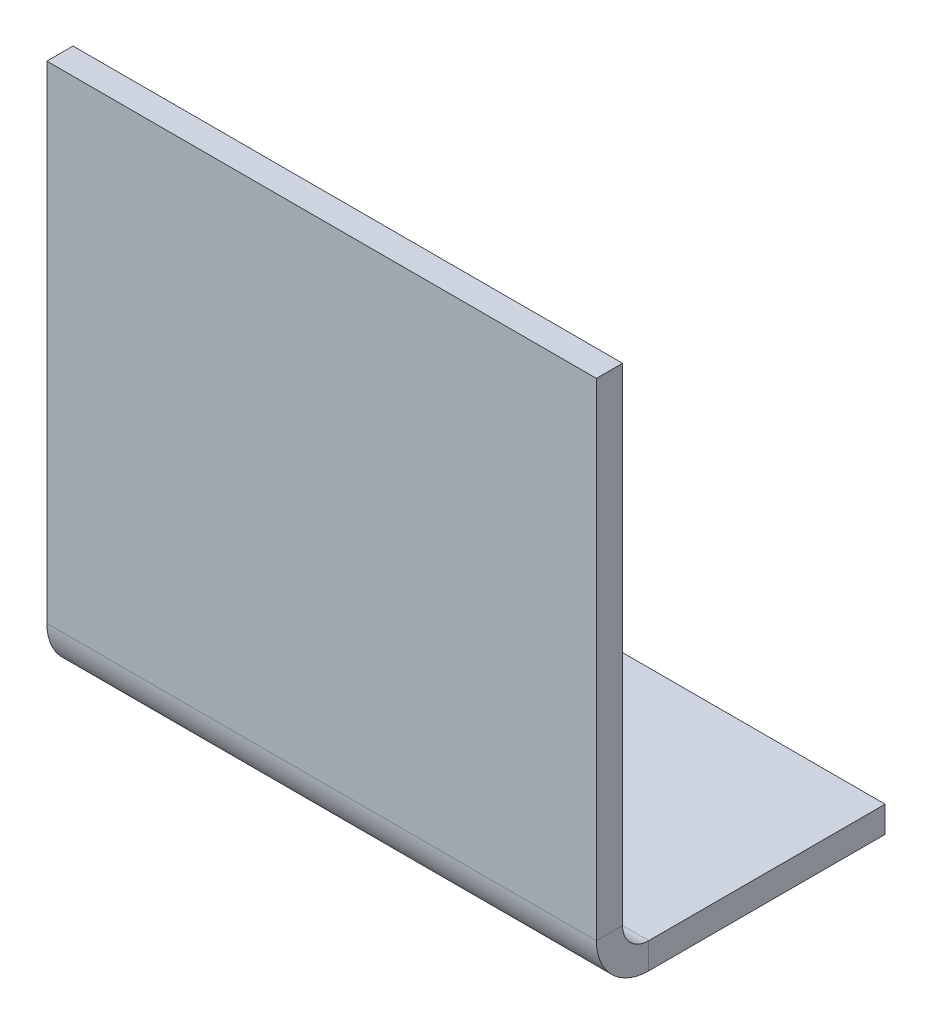
ISO-10303-21;
HEADER;
FILE_DESCRIPTION(('STEP AP214'),'2;1');
FILE_NAME('part.step','',(''),(''),'','','');
FILE_SCHEMA(('AUTOMOTIVE_DESIGN { 1 0 10303 214 1 1 1 1 }'));
ENDSEC;
DATA;
#1=APPLICATION_CONTEXT('core data for automotive mechanical design processes');
#2=APPLICATION_PROTOCOL_DEFINITION('international standard','automotive_design',2000,#1);
#3=PRODUCT_CONTEXT('',#1,'mechanical');
#4=PRODUCT('Part','Part','',(#3));
#5=PRODUCT_RELATED_PRODUCT_CATEGORY('part','',(#4));
#6=PRODUCT_DEFINITION_FORMATION('','',#4);
#7=PRODUCT_DEFINITION_CONTEXT('part definition',#1,'design');
#8=PRODUCT_DEFINITION('design','',#6,#7);
#9=PRODUCT_DEFINITION_SHAPE('','',#8);
#10=(LENGTH_UNIT() NAMED_UNIT(*) SI_UNIT(.MILLI.,.METRE.));
#11=(NAMED_UNIT(*) PLANE_ANGLE_UNIT() SI_UNIT($,.RADIAN.));
#12=(NAMED_UNIT(*) SI_UNIT($,.STERADIAN.) SOLID_ANGLE_UNIT());
#13=UNCERTAINTY_MEASURE_WITH_UNIT(LENGTH_MEASURE(1.E-05),#10,'distance_accuracy_value','');
#14=(GEOMETRIC_REPRESENTATION_CONTEXT(3) GLOBAL_UNCERTAINTY_ASSIGNED_CONTEXT((#13)) GLOBAL_UNIT_ASSIGNED_CONTEXT((#10,
#11,#12)) REPRESENTATION_CONTEXT('',''));
#15=CARTESIAN_POINT('',(0.,0.,0.));
#16=DIRECTION('',(0.,0.,1.));
#17=DIRECTION('',(1.,0.,0.));
#18=AXIS2_PLACEMENT_3D('',#15,#16,#17);
#19=CARTESIAN_POINT('',(0.,-20.7823889803847,22.0700000000001));
#20=DIRECTION('',(-1.,0.,0.));
#21=DIRECTION('',(0.,1.,0.));
#22=AXIS2_PLACEMENT_3D('',#19,#20,#21);
#23=PLANE('',#22);
#24=DIRECTION('',(0.,1.,0.));
#25=VECTOR('',#24,1.);
#26=CARTESIAN_POINT('',(0.,-20.7823889803847,20.0700000000001));
#27=LINE('',#26,#25);
#28=CARTESIAN_POINT('',(0.,2.00000000000001,20.07));
#29=VERTEX_POINT('',#28);
#30=CARTESIAN_POINT('',(0.,39.2176110196153,20.0699999999999));
#31=VERTEX_POINT('',#30);
#32=EDGE_CURVE('E74',#29,#31,#27,.T.);
#33=ORIENTED_EDGE('',*,*,#32,.F.);
#34=DIRECTION('',(0.,0.,1.));
#35=VECTOR('',#34,1.);
#36=CARTESIAN_POINT('',(0.,2.00000000000001,22.07));
#37=LINE('',#36,#35);
#38=CARTESIAN_POINT('',(0.,2.00000000000001,22.07));
#39=VERTEX_POINT('',#38);
#40=EDGE_CURVE('E115',#29,#39,#37,.T.);
#41=ORIENTED_EDGE('',*,*,#40,.T.);
#42=DIRECTION('',(0.,1.,0.));
#43=VECTOR('',#42,1.);
#44=CARTESIAN_POINT('',(0.,-20.7823889803847,22.0700000000001));
#45=LINE('',#44,#43);
#46=CARTESIAN_POINT('',(0.,39.2176110196153,22.0699999999999));
#47=VERTEX_POINT('',#46);
#48=EDGE_CURVE('E53',#39,#47,#45,.T.);
#49=ORIENTED_EDGE('',*,*,#48,.T.);
#50=DIRECTION('',(0.,0.,-1.));
#51=VECTOR('',#50,1.);
#52=CARTESIAN_POINT('',(0.,39.2176110196153,22.0699999999999));
#53=LINE('',#52,#51);
#54=EDGE_CURVE('E218',#47,#31,#53,.T.);
#55=ORIENTED_EDGE('',*,*,#54,.T.);
#56=EDGE_LOOP('',(#33,#41,#49,#55));
#57=FACE_BOUND('',#56,.T.);
#58=ADVANCED_FACE('F49',(#57),#23,.T.);
#59=CARTESIAN_POINT('',(42.,-20.7823889803847,22.0700000000001));
#60=DIRECTION('',(1.,0.,0.));
#61=DIRECTION('',(0.,-1.,0.));
#62=AXIS2_PLACEMENT_3D('',#59,#60,#61);
#63=PLANE('',#62);
#64=DIRECTION('',(0.,-1.,0.));
#65=VECTOR('',#64,1.);
#66=CARTESIAN_POINT('',(42.,-20.7823889803847,22.0700000000001));
#67=LINE('',#66,#65);
#68=CARTESIAN_POINT('',(42.,39.2176110196153,22.0699999999999));
#69=VERTEX_POINT('',#68);
#70=CARTESIAN_POINT('',(42.,2.00000000000001,22.07));
#71=VERTEX_POINT('',#70);
#72=EDGE_CURVE('E212',#69,#71,#67,.T.);
#73=ORIENTED_EDGE('',*,*,#72,.T.);
#74=DIRECTION('',(0.,0.,-1.));
#75=VECTOR('',#74,1.);
#76=CARTESIAN_POINT('',(42.,2.00000000000001,22.07));
#77=LINE('',#76,#75);
#78=CARTESIAN_POINT('',(42.,2.00000000000001,20.07));
#79=VERTEX_POINT('',#78);
#80=EDGE_CURVE('E12',#71,#79,#77,.T.);
#81=ORIENTED_EDGE('',*,*,#80,.T.);
#82=DIRECTION('',(0.,-1.,0.));
#83=VECTOR('',#82,1.);
#84=CARTESIAN_POINT('',(42.,-20.7823889803847,20.0700000000001));
#85=LINE('',#84,#83);
#86=CARTESIAN_POINT('',(42.,39.2176110196153,20.0699999999999));
#87=VERTEX_POINT('',#86);
#88=EDGE_CURVE('E67',#87,#79,#85,.T.);
#89=ORIENTED_EDGE('',*,*,#88,.F.);
#90=DIRECTION('',(0.,0.,-1.));
#91=VECTOR('',#90,1.);
#92=CARTESIAN_POINT('',(42.,39.2176110196153,22.0699999999999));
#93=LINE('',#92,#91);
#94=EDGE_CURVE('E143',#69,#87,#93,.T.);
#95=ORIENTED_EDGE('',*,*,#94,.F.);
#96=EDGE_LOOP('',(#73,#81,#89,#95));
#97=FACE_BOUND('',#96,.T.);
#98=ADVANCED_FACE('F51',(#97),#63,.T.);
#99=CARTESIAN_POINT('',(0.,-20.7823889803847,20.0700000000001));
#100=DIRECTION('',(0.,0.,-1.));
#101=DIRECTION('',(0.,1.,0.));
#102=AXIS2_PLACEMENT_3D('',#99,#100,#101);
#103=PLANE('',#102);
#104=ORIENTED_EDGE('',*,*,#88,.T.);
#105=DIRECTION('',(-1.,0.,0.));
#106=VECTOR('',#105,1.);
#107=CARTESIAN_POINT('',(0.,2.00000000000001,20.07));
#108=LINE('',#107,#106);
#109=EDGE_CURVE('E59',#79,#29,#108,.T.);
#110=ORIENTED_EDGE('',*,*,#109,.T.);
#111=ORIENTED_EDGE('',*,*,#32,.T.);
#112=DIRECTION('',(1.,0.,0.));
#113=VECTOR('',#112,1.);
#114=CARTESIAN_POINT('',(0.,39.2176110196153,20.0699999999999));
#115=LINE('',#114,#113);
#116=EDGE_CURVE('E213',#31,#87,#115,.T.);
#117=ORIENTED_EDGE('',*,*,#116,.T.);
#118=EDGE_LOOP('',(#104,#110,#111,#117));
#119=FACE_BOUND('',#118,.T.);
#120=ADVANCED_FACE('F227',(#119),#103,.T.);
#121=CARTESIAN_POINT('',(0.,39.2176110196153,22.0699999999999));
#122=DIRECTION('',(0.,1.,0.));
#123=DIRECTION('',(1.,0.,0.));
#124=AXIS2_PLACEMENT_3D('',#121,#122,#123);
#125=PLANE('',#124);
#126=ORIENTED_EDGE('',*,*,#116,.F.);
#127=ORIENTED_EDGE('',*,*,#54,.F.);
#128=DIRECTION('',(1.,0.,0.));
#129=VECTOR('',#128,1.);
#130=CARTESIAN_POINT('',(0.,39.2176110196153,22.0699999999999));
#131=LINE('',#130,#129);
#132=EDGE_CURVE('E132',#47,#69,#131,.T.);
#133=ORIENTED_EDGE('',*,*,#132,.T.);
#134=ORIENTED_EDGE('',*,*,#94,.T.);
#135=EDGE_LOOP('',(#126,#127,#133,#134));
#136=FACE_BOUND('',#135,.T.);
#137=ADVANCED_FACE('F231',(#136),#125,.T.);
#138=CARTESIAN_POINT('',(0.,-20.7823889803847,22.0700000000001));
#139=DIRECTION('',(0.,0.,-1.));
#140=DIRECTION('',(0.,1.,0.));
#141=AXIS2_PLACEMENT_3D('',#138,#139,#140);
#142=PLANE('',#141);
#143=DIRECTION('',(-1.,0.,0.));
#144=VECTOR('',#143,1.);
#145=CARTESIAN_POINT('',(0.,2.00000000000001,22.07));
#146=LINE('',#145,#144);
#147=EDGE_CURVE('E123',#71,#39,#146,.T.);
#148=ORIENTED_EDGE('',*,*,#147,.F.);
#149=ORIENTED_EDGE('',*,*,#72,.F.);
#150=ORIENTED_EDGE('',*,*,#132,.F.);
#151=ORIENTED_EDGE('',*,*,#48,.F.);
#152=EDGE_LOOP('',(#148,#149,#150,#151));
#153=FACE_BOUND('',#152,.T.);
#154=ADVANCED_FACE('F128',(#153),#142,.F.);
#155=CARTESIAN_POINT('',(0.,-2.,0.));
#156=DIRECTION('',(0.,0.,-1.));
#157=DIRECTION('',(-1.,0.,0.));
#158=AXIS2_PLACEMENT_3D('',#155,#156,#157);
#159=PLANE('',#158);
#160=DIRECTION('',(-1.,0.,0.));
#161=VECTOR('',#160,1.);
#162=CARTESIAN_POINT('',(0.,0.,0.));
#163=LINE('',#162,#161);
#164=CARTESIAN_POINT('',(42.,0.,0.));
#165=VERTEX_POINT('',#164);
#166=CARTESIAN_POINT('',(0.,0.,0.));
#167=VERTEX_POINT('',#166);
#168=EDGE_CURVE('E176',#165,#167,#163,.T.);
#169=ORIENTED_EDGE('',*,*,#168,.F.);
#170=DIRECTION('',(0.,1.,0.));
#171=VECTOR('',#170,1.);
#172=CARTESIAN_POINT('',(42.,-2.,0.));
#173=LINE('',#172,#171);
#174=CARTESIAN_POINT('',(42.,-2.,0.));
#175=VERTEX_POINT('',#174);
#176=EDGE_CURVE('E166',#175,#165,#173,.T.);
#177=ORIENTED_EDGE('',*,*,#176,.F.);
#178=DIRECTION('',(-1.,0.,0.));
#179=VECTOR('',#178,1.);
#180=CARTESIAN_POINT('',(0.,-2.,0.));
#181=LINE('',#180,#179);
#182=CARTESIAN_POINT('',(0.,-2.,0.));
#183=VERTEX_POINT('',#182);
#184=EDGE_CURVE('E201',#175,#183,#181,.T.);
#185=ORIENTED_EDGE('',*,*,#184,.T.);
#186=DIRECTION('',(0.,1.,0.));
#187=VECTOR('',#186,1.);
#188=CARTESIAN_POINT('',(0.,-2.,0.));
#189=LINE('',#188,#187);
#190=EDGE_CURVE('E198',#183,#167,#189,.T.);
#191=ORIENTED_EDGE('',*,*,#190,.T.);
#192=EDGE_LOOP('',(#169,#177,#185,#191));
#193=FACE_BOUND('',#192,.T.);
#194=ADVANCED_FACE('F256',(#193),#159,.T.);
#195=CARTESIAN_POINT('',(21.,-2.,10.));
#196=DIRECTION('',(0.,1.,0.));
#197=DIRECTION('',(0.,0.,1.));
#198=AXIS2_PLACEMENT_3D('',#195,#196,#197);
#199=CYLINDRICAL_SURFACE('',#198,3.5);
#200=CARTESIAN_POINT('',(21.,-2.,10.));
#201=DIRECTION('',(0.,1.,0.));
#202=DIRECTION('',(0.,0.,1.));
#203=AXIS2_PLACEMENT_3D('',#200,#201,#202);
#204=CIRCLE('',#203,3.5);
#205=CARTESIAN_POINT('',(21.,-2.,13.5));
#206=VERTEX_POINT('',#205);
#207=EDGE_CURVE('E190',#206,#206,#204,.T.);
#208=ORIENTED_EDGE('',*,*,#207,.F.);
#209=EDGE_LOOP('',(#208));
#210=FACE_BOUND('',#209,.T.);
#211=CARTESIAN_POINT('',(21.,0.,10.));
#212=DIRECTION('',(0.,1.,0.));
#213=DIRECTION('',(0.,0.,1.));
#214=AXIS2_PLACEMENT_3D('',#211,#212,#213);
#215=CIRCLE('',#214,3.5);
#216=CARTESIAN_POINT('',(21.,0.,13.5));
#217=VERTEX_POINT('',#216);
#218=EDGE_CURVE('E194',#217,#217,#215,.T.);
#219=ORIENTED_EDGE('',*,*,#218,.T.);
#220=EDGE_LOOP('',(#219));
#221=FACE_BOUND('',#220,.T.);
#222=ADVANCED_FACE('F258',(#210,#221),#199,.F.);
#223=CARTESIAN_POINT('',(0.,-2.,0.));
#224=DIRECTION('',(0.,1.,0.));
#225=DIRECTION('',(0.,0.,1.));
#226=AXIS2_PLACEMENT_3D('',#223,#224,#225);
#227=PLANE('',#226);
#228=ORIENTED_EDGE('',*,*,#207,.T.);
#229=EDGE_LOOP('',(#228));
#230=FACE_BOUND('',#229,.T.);
#231=DIRECTION('',(0.,0.,-1.));
#232=VECTOR('',#231,1.);
#233=CARTESIAN_POINT('',(42.,-2.,0.));
#234=LINE('',#233,#232);
#235=CARTESIAN_POINT('',(42.,-2.,18.07));
#236=VERTEX_POINT('',#235);
#237=EDGE_CURVE('E170',#236,#175,#234,.T.);
#238=ORIENTED_EDGE('',*,*,#237,.F.);
#239=DIRECTION('',(-1.,0.,0.));
#240=VECTOR('',#239,1.);
#241=CARTESIAN_POINT('',(0.,-2.,18.07));
#242=LINE('',#241,#240);
#243=CARTESIAN_POINT('',(0.,-2.,18.07));
#244=VERTEX_POINT('',#243);
#245=EDGE_CURVE('E186',#236,#244,#242,.T.);
#246=ORIENTED_EDGE('',*,*,#245,.T.);
#247=DIRECTION('',(0.,0.,1.));
#248=VECTOR('',#247,1.);
#249=CARTESIAN_POINT('',(0.,-2.,0.));
#250=LINE('',#249,#248);
#251=EDGE_CURVE('E183',#183,#244,#250,.T.);
#252=ORIENTED_EDGE('',*,*,#251,.F.);
#253=ORIENTED_EDGE('',*,*,#184,.F.);
#254=EDGE_LOOP('',(#238,#246,#252,#253));
#255=FACE_BOUND('',#254,.T.);
#256=ADVANCED_FACE('F254',(#230,#255),#227,.F.);
#257=CARTESIAN_POINT('',(0.,-2.,0.));
#258=DIRECTION('',(-1.,0.,0.));
#259=DIRECTION('',(0.,0.,1.));
#260=AXIS2_PLACEMENT_3D('',#257,#258,#259);
#261=PLANE('',#260);
#262=DIRECTION('',(0.,-1.,0.));
#263=VECTOR('',#262,1.);
#264=CARTESIAN_POINT('',(0.,-2.,18.07));
#265=LINE('',#264,#263);
#266=CARTESIAN_POINT('',(0.,0.,18.07));
#267=VERTEX_POINT('',#266);
#268=EDGE_CURVE('E148',#267,#244,#265,.T.);
#269=ORIENTED_EDGE('',*,*,#268,.F.);
#270=DIRECTION('',(0.,0.,1.));
#271=VECTOR('',#270,1.);
#272=CARTESIAN_POINT('',(0.,0.,0.));
#273=LINE('',#272,#271);
#274=EDGE_CURVE('E173',#167,#267,#273,.T.);
#275=ORIENTED_EDGE('',*,*,#274,.F.);
#276=ORIENTED_EDGE('',*,*,#190,.F.);
#277=ORIENTED_EDGE('',*,*,#251,.T.);
#278=EDGE_LOOP('',(#269,#275,#276,#277));
#279=FACE_BOUND('',#278,.T.);
#280=ADVANCED_FACE('F250',(#279),#261,.T.);
#281=CARTESIAN_POINT('',(0.,0.,0.));
#282=DIRECTION('',(0.,1.,0.));
#283=DIRECTION('',(0.,0.,1.));
#284=AXIS2_PLACEMENT_3D('',#281,#282,#283);
#285=PLANE('',#284);
#286=DIRECTION('',(-1.,0.,0.));
#287=VECTOR('',#286,1.);
#288=CARTESIAN_POINT('',(0.,0.,18.07));
#289=LINE('',#288,#287);
#290=CARTESIAN_POINT('',(42.,0.,18.07));
#291=VERTEX_POINT('',#290);
#292=EDGE_CURVE('E155',#291,#267,#289,.T.);
#293=ORIENTED_EDGE('',*,*,#292,.F.);
#294=DIRECTION('',(0.,0.,-1.));
#295=VECTOR('',#294,1.);
#296=CARTESIAN_POINT('',(42.,0.,0.));
#297=LINE('',#296,#295);
#298=EDGE_CURVE('E180',#291,#165,#297,.T.);
#299=ORIENTED_EDGE('',*,*,#298,.T.);
#300=ORIENTED_EDGE('',*,*,#168,.T.);
#301=ORIENTED_EDGE('',*,*,#274,.T.);
#302=EDGE_LOOP('',(#293,#299,#300,#301));
#303=FACE_BOUND('',#302,.T.);
#304=ORIENTED_EDGE('',*,*,#218,.F.);
#305=EDGE_LOOP('',(#304));
#306=FACE_BOUND('',#305,.T.);
#307=ADVANCED_FACE('F246',(#303,#306),#285,.T.);
#308=CARTESIAN_POINT('',(42.,-2.,0.));
#309=DIRECTION('',(1.,0.,0.));
#310=DIRECTION('',(0.,0.,-1.));
#311=AXIS2_PLACEMENT_3D('',#308,#309,#310);
#312=PLANE('',#311);
#313=DIRECTION('',(0.,1.,0.));
#314=VECTOR('',#313,1.);
#315=CARTESIAN_POINT('',(42.,-2.,18.07));
#316=LINE('',#315,#314);
#317=EDGE_CURVE('E150',#236,#291,#316,.T.);
#318=ORIENTED_EDGE('',*,*,#317,.F.);
#319=ORIENTED_EDGE('',*,*,#237,.T.);
#320=ORIENTED_EDGE('',*,*,#176,.T.);
#321=ORIENTED_EDGE('',*,*,#298,.F.);
#322=EDGE_LOOP('',(#318,#319,#320,#321));
#323=FACE_BOUND('',#322,.T.);
#324=ADVANCED_FACE('F241',(#323),#312,.T.);
#325=CARTESIAN_POINT('',(42.,2.,18.07));
#326=DIRECTION('',(1.,0.,0.));
#327=DIRECTION('',(0.,0.,-1.));
#328=AXIS2_PLACEMENT_3D('',#325,#326,#327);
#329=PLANE('',#328);
#330=ORIENTED_EDGE('',*,*,#317,.T.);
#331=CARTESIAN_POINT('',(42.,2.,18.07));
#332=DIRECTION('',(-1.,0.,0.));
#333=DIRECTION('',(0.,0.,1.));
#334=AXIS2_PLACEMENT_3D('',#331,#332,#333);
#335=CIRCLE('',#334,2.);
#336=EDGE_CURVE('E162',#291,#79,#335,.T.);
#337=ORIENTED_EDGE('',*,*,#336,.T.);
#338=ORIENTED_EDGE('',*,*,#80,.F.);
#339=CARTESIAN_POINT('',(42.,2.,18.07));
#340=DIRECTION('',(-1.,0.,0.));
#341=DIRECTION('',(0.,0.,-1.));
#342=AXIS2_PLACEMENT_3D('',#339,#340,#341);
#343=CIRCLE('',#342,4.);
#344=EDGE_CURVE('E141',#236,#71,#343,.T.);
#345=ORIENTED_EDGE('',*,*,#344,.F.);
#346=EDGE_LOOP('',(#330,#337,#338,#345));
#347=FACE_BOUND('',#346,.T.);
#348=ADVANCED_FACE('F238',(#347),#329,.T.);
#349=CARTESIAN_POINT('',(0.,2.,18.07));
#350=DIRECTION('',(-1.,0.,0.));
#351=DIRECTION('',(0.,0.,1.));
#352=AXIS2_PLACEMENT_3D('',#349,#350,#351);
#353=PLANE('',#352);
#354=ORIENTED_EDGE('',*,*,#40,.F.);
#355=CARTESIAN_POINT('',(0.,2.,18.07));
#356=DIRECTION('',(-1.,0.,0.));
#357=DIRECTION('',(0.,0.,1.));
#358=AXIS2_PLACEMENT_3D('',#355,#356,#357);
#359=CIRCLE('',#358,2.);
#360=EDGE_CURVE('E157',#29,#267,#359,.F.);
#361=ORIENTED_EDGE('',*,*,#360,.T.);
#362=ORIENTED_EDGE('',*,*,#268,.T.);
#363=CARTESIAN_POINT('',(0.,2.,18.07));
#364=DIRECTION('',(1.,0.,0.));
#365=DIRECTION('',(0.,0.,1.));
#366=AXIS2_PLACEMENT_3D('',#363,#364,#365);
#367=CIRCLE('',#366,4.);
#368=EDGE_CURVE('E139',#39,#244,#367,.T.);
#369=ORIENTED_EDGE('',*,*,#368,.F.);
#370=EDGE_LOOP('',(#354,#361,#362,#369));
#371=FACE_BOUND('',#370,.T.);
#372=ADVANCED_FACE('F146',(#371),#353,.T.);
#373=CARTESIAN_POINT('',(63.3108332451921,2.,18.07));
#374=DIRECTION('',(-1.,0.,0.));
#375=DIRECTION('',(0.,0.,1.));
#376=AXIS2_PLACEMENT_3D('',#373,#374,#375);
#377=CYLINDRICAL_SURFACE('',#376,4.);
#378=ORIENTED_EDGE('',*,*,#368,.T.);
#379=ORIENTED_EDGE('',*,*,#245,.F.);
#380=ORIENTED_EDGE('',*,*,#344,.T.);
#381=ORIENTED_EDGE('',*,*,#147,.T.);
#382=EDGE_LOOP('',(#378,#379,#380,#381));
#383=FACE_BOUND('',#382,.T.);
#384=ADVANCED_FACE('F137',(#383),#377,.T.);
#385=CARTESIAN_POINT('',(63.3108332451921,2.,18.07));
#386=DIRECTION('',(-1.,0.,0.));
#387=DIRECTION('',(0.,0.,1.));
#388=AXIS2_PLACEMENT_3D('',#385,#386,#387);
#389=CYLINDRICAL_SURFACE('',#388,2.);
#390=ORIENTED_EDGE('',*,*,#360,.F.);
#391=ORIENTED_EDGE('',*,*,#109,.F.);
#392=ORIENTED_EDGE('',*,*,#336,.F.);
#393=ORIENTED_EDGE('',*,*,#292,.T.);
#394=EDGE_LOOP('',(#390,#391,#392,#393));
#395=FACE_BOUND('',#394,.T.);
#396=ADVANCED_FACE('F237',(#395),#389,.F.);
#397=CLOSED_SHELL('',(#58,#98,#120,#137,#154,#194,#222,#256,#280,#307,#324,#348,#372,#384,#396));
#398=MANIFOLD_SOLID_BREP('B2',#397);
#399=ADVANCED_BREP_SHAPE_REPRESENTATION('',(#18,#398),#14);
#400=SHAPE_DEFINITION_REPRESENTATION(#9,#399);
ENDSEC;
END-ISO-10303-21;
